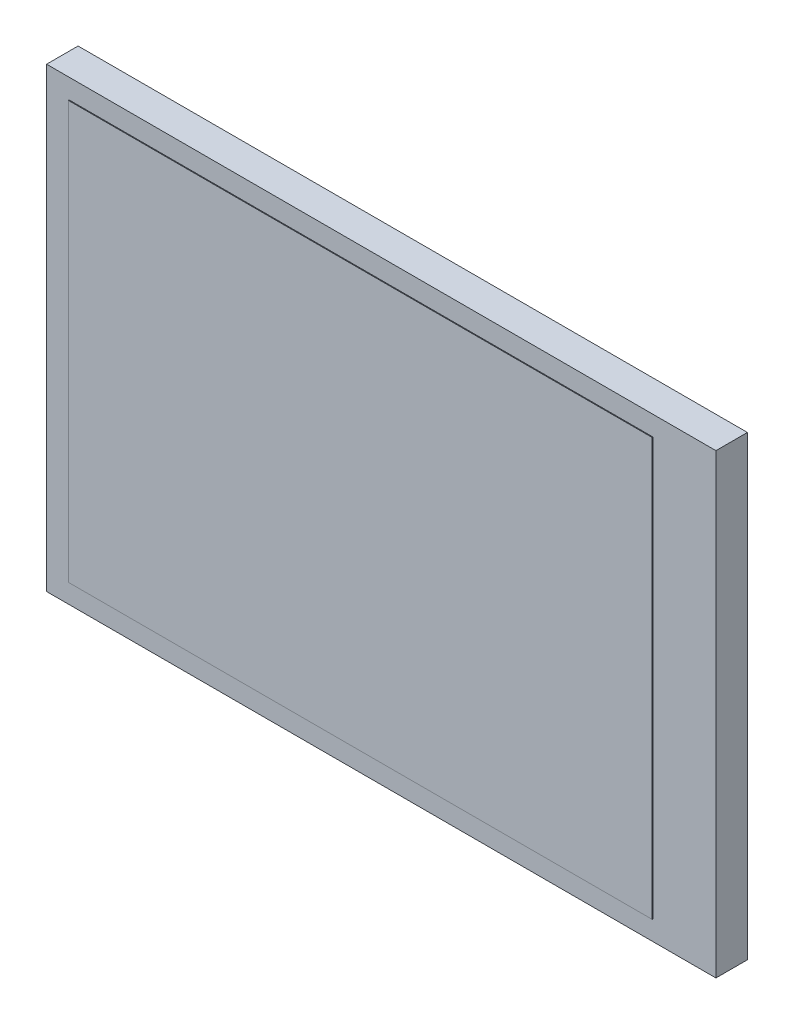
ISO-10303-21;
HEADER;
FILE_DESCRIPTION(('STEP AP214'),'2;1');
FILE_NAME('part.step','',(''),(''),'','','');
FILE_SCHEMA(('AUTOMOTIVE_DESIGN { 1 0 10303 214 1 1 1 1 }'));
ENDSEC;
DATA;
#1=APPLICATION_CONTEXT('core data for automotive mechanical design processes');
#2=APPLICATION_PROTOCOL_DEFINITION('international standard','automotive_design',2000,#1);
#3=PRODUCT_CONTEXT('',#1,'mechanical');
#4=PRODUCT('Part','Part','',(#3));
#5=PRODUCT_RELATED_PRODUCT_CATEGORY('part','',(#4));
#6=PRODUCT_DEFINITION_FORMATION('','',#4);
#7=PRODUCT_DEFINITION_CONTEXT('part definition',#1,'design');
#8=PRODUCT_DEFINITION('design','',#6,#7);
#9=PRODUCT_DEFINITION_SHAPE('','',#8);
#10=(LENGTH_UNIT() NAMED_UNIT(*) SI_UNIT(.MILLI.,.METRE.));
#11=(NAMED_UNIT(*) PLANE_ANGLE_UNIT() SI_UNIT($,.RADIAN.));
#12=(NAMED_UNIT(*) SI_UNIT($,.STERADIAN.) SOLID_ANGLE_UNIT());
#13=UNCERTAINTY_MEASURE_WITH_UNIT(LENGTH_MEASURE(1.E-05),#10,'distance_accuracy_value','');
#14=(GEOMETRIC_REPRESENTATION_CONTEXT(3) GLOBAL_UNCERTAINTY_ASSIGNED_CONTEXT((#13)) GLOBAL_UNIT_ASSIGNED_CONTEXT((#10,
#11,#12)) REPRESENTATION_CONTEXT('',''));
#15=CARTESIAN_POINT('',(0.,0.,0.));
#16=DIRECTION('',(0.,0.,1.));
#17=DIRECTION('',(1.,0.,0.));
#18=AXIS2_PLACEMENT_3D('',#15,#16,#17);
#19=CARTESIAN_POINT('',(0.,0.,4.));
#20=DIRECTION('',(-1.,0.,0.));
#21=DIRECTION('',(0.,0.,1.));
#22=AXIS2_PLACEMENT_3D('',#19,#20,#21);
#23=PLANE('',#22);
#24=DIRECTION('',(0.,1.,0.));
#25=VECTOR('',#24,1.);
#26=CARTESIAN_POINT('',(0.,0.,0.));
#27=LINE('',#26,#25);
#28=CARTESIAN_POINT('',(0.,0.,0.));
#29=VERTEX_POINT('',#28);
#30=CARTESIAN_POINT('',(0.,58.,0.));
#31=VERTEX_POINT('',#30);
#32=EDGE_CURVE('E129',#29,#31,#27,.T.);
#33=ORIENTED_EDGE('',*,*,#32,.T.);
#34=DIRECTION('',(0.,0.,-1.));
#35=VECTOR('',#34,1.);
#36=CARTESIAN_POINT('',(0.,58.,4.));
#37=LINE('',#36,#35);
#38=CARTESIAN_POINT('',(0.,58.,4.));
#39=VERTEX_POINT('',#38);
#40=EDGE_CURVE('E11',#39,#31,#37,.T.);
#41=ORIENTED_EDGE('',*,*,#40,.F.);
#42=DIRECTION('',(0.,1.,0.));
#43=VECTOR('',#42,1.);
#44=CARTESIAN_POINT('',(0.,0.,4.));
#45=LINE('',#44,#43);
#46=CARTESIAN_POINT('',(0.,0.,4.));
#47=VERTEX_POINT('',#46);
#48=EDGE_CURVE('E140',#47,#39,#45,.T.);
#49=ORIENTED_EDGE('',*,*,#48,.F.);
#50=DIRECTION('',(0.,0.,-1.));
#51=VECTOR('',#50,1.);
#52=CARTESIAN_POINT('',(0.,0.,4.));
#53=LINE('',#52,#51);
#54=EDGE_CURVE('E153',#47,#29,#53,.T.);
#55=ORIENTED_EDGE('',*,*,#54,.T.);
#56=EDGE_LOOP('',(#33,#41,#49,#55));
#57=FACE_BOUND('',#56,.T.);
#58=ADVANCED_FACE('F41',(#57),#23,.F.);
#59=CARTESIAN_POINT('',(0.,58.,4.));
#60=DIRECTION('',(0.,-1.,0.));
#61=DIRECTION('',(1.,0.,0.));
#62=AXIS2_PLACEMENT_3D('',#59,#60,#61);
#63=PLANE('',#62);
#64=DIRECTION('',(-1.,0.,0.));
#65=VECTOR('',#64,1.);
#66=CARTESIAN_POINT('',(0.,58.,0.));
#67=LINE('',#66,#65);
#68=CARTESIAN_POINT('',(-85.,58.,0.));
#69=VERTEX_POINT('',#68);
#70=EDGE_CURVE('E134',#31,#69,#67,.T.);
#71=ORIENTED_EDGE('',*,*,#70,.T.);
#72=DIRECTION('',(0.,0.,-1.));
#73=VECTOR('',#72,1.);
#74=CARTESIAN_POINT('',(-85.,58.,4.));
#75=LINE('',#74,#73);
#76=CARTESIAN_POINT('',(-85.,58.,4.));
#77=VERTEX_POINT('',#76);
#78=EDGE_CURVE('E49',#77,#69,#75,.T.);
#79=ORIENTED_EDGE('',*,*,#78,.F.);
#80=DIRECTION('',(-1.,0.,0.));
#81=VECTOR('',#80,1.);
#82=CARTESIAN_POINT('',(0.,58.,4.));
#83=LINE('',#82,#81);
#84=EDGE_CURVE('E144',#39,#77,#83,.T.);
#85=ORIENTED_EDGE('',*,*,#84,.F.);
#86=ORIENTED_EDGE('',*,*,#40,.T.);
#87=EDGE_LOOP('',(#71,#79,#85,#86));
#88=FACE_BOUND('',#87,.T.);
#89=ADVANCED_FACE('F190',(#88),#63,.F.);
#90=CARTESIAN_POINT('',(-85.,0.,4.));
#91=DIRECTION('',(1.,0.,0.));
#92=DIRECTION('',(0.,0.,-1.));
#93=AXIS2_PLACEMENT_3D('',#90,#91,#92);
#94=PLANE('',#93);
#95=DIRECTION('',(0.,-1.,0.));
#96=VECTOR('',#95,1.);
#97=CARTESIAN_POINT('',(-85.,0.,0.));
#98=LINE('',#97,#96);
#99=CARTESIAN_POINT('',(-85.,0.,0.));
#100=VERTEX_POINT('',#99);
#101=EDGE_CURVE('E157',#69,#100,#98,.T.);
#102=ORIENTED_EDGE('',*,*,#101,.T.);
#103=DIRECTION('',(0.,0.,-1.));
#104=VECTOR('',#103,1.);
#105=CARTESIAN_POINT('',(-85.,0.,4.));
#106=LINE('',#105,#104);
#107=CARTESIAN_POINT('',(-85.,0.,4.));
#108=VERTEX_POINT('',#107);
#109=EDGE_CURVE('E165',#108,#100,#106,.T.);
#110=ORIENTED_EDGE('',*,*,#109,.F.);
#111=DIRECTION('',(0.,-1.,0.));
#112=VECTOR('',#111,1.);
#113=CARTESIAN_POINT('',(-85.,0.,4.));
#114=LINE('',#113,#112);
#115=EDGE_CURVE('E148',#77,#108,#114,.T.);
#116=ORIENTED_EDGE('',*,*,#115,.F.);
#117=ORIENTED_EDGE('',*,*,#78,.T.);
#118=EDGE_LOOP('',(#102,#110,#116,#117));
#119=FACE_BOUND('',#118,.T.);
#120=ADVANCED_FACE('F174',(#119),#94,.F.);
#121=CARTESIAN_POINT('',(0.,0.,4.));
#122=DIRECTION('',(0.,1.,0.));
#123=DIRECTION('',(0.,0.,1.));
#124=AXIS2_PLACEMENT_3D('',#121,#122,#123);
#125=PLANE('',#124);
#126=DIRECTION('',(1.,0.,0.));
#127=VECTOR('',#126,1.);
#128=CARTESIAN_POINT('',(0.,0.,0.));
#129=LINE('',#128,#127);
#130=EDGE_CURVE('E145',#100,#29,#129,.T.);
#131=ORIENTED_EDGE('',*,*,#130,.T.);
#132=ORIENTED_EDGE('',*,*,#54,.F.);
#133=DIRECTION('',(1.,0.,0.));
#134=VECTOR('',#133,1.);
#135=CARTESIAN_POINT('',(0.,0.,4.));
#136=LINE('',#135,#134);
#137=EDGE_CURVE('E151',#108,#47,#136,.T.);
#138=ORIENTED_EDGE('',*,*,#137,.F.);
#139=ORIENTED_EDGE('',*,*,#109,.T.);
#140=EDGE_LOOP('',(#131,#132,#138,#139));
#141=FACE_BOUND('',#140,.T.);
#142=ADVANCED_FACE('F183',(#141),#125,.F.);
#143=CARTESIAN_POINT('',(0.,0.,4.));
#144=DIRECTION('',(0.,0.,1.));
#145=DIRECTION('',(1.,0.,0.));
#146=AXIS2_PLACEMENT_3D('',#143,#144,#145);
#147=PLANE('',#146);
#148=DIRECTION('',(-1.,0.,0.));
#149=VECTOR('',#148,1.);
#150=CARTESIAN_POINT('',(-7.99999999999999,55.5,4.));
#151=LINE('',#150,#149);
#152=CARTESIAN_POINT('',(-7.99999999999999,55.5,4.));
#153=VERTEX_POINT('',#152);
#154=CARTESIAN_POINT('',(-82.1441316608199,55.5,4.));
#155=VERTEX_POINT('',#154);
#156=EDGE_CURVE('E56',#153,#155,#151,.T.);
#157=ORIENTED_EDGE('',*,*,#156,.F.);
#158=DIRECTION('',(0.,1.,0.));
#159=VECTOR('',#158,1.);
#160=CARTESIAN_POINT('',(-7.99999999999999,2.5,4.));
#161=LINE('',#160,#159);
#162=CARTESIAN_POINT('',(-7.99999999999999,2.5,4.));
#163=VERTEX_POINT('',#162);
#164=EDGE_CURVE('E60',#163,#153,#161,.T.);
#165=ORIENTED_EDGE('',*,*,#164,.F.);
#166=DIRECTION('',(1.,0.,0.));
#167=VECTOR('',#166,1.);
#168=CARTESIAN_POINT('',(-82.1441316608199,2.5,4.));
#169=LINE('',#168,#167);
#170=CARTESIAN_POINT('',(-82.1441316608199,2.5,4.));
#171=VERTEX_POINT('',#170);
#172=EDGE_CURVE('E299',#171,#163,#169,.T.);
#173=ORIENTED_EDGE('',*,*,#172,.F.);
#174=DIRECTION('',(0.,-1.,0.));
#175=VECTOR('',#174,1.);
#176=CARTESIAN_POINT('',(-82.1441316608199,55.5,4.));
#177=LINE('',#176,#175);
#178=EDGE_CURVE('E309',#155,#171,#177,.T.);
#179=ORIENTED_EDGE('',*,*,#178,.F.);
#180=EDGE_LOOP('',(#157,#165,#173,#179));
#181=FACE_BOUND('',#180,.T.);
#182=ORIENTED_EDGE('',*,*,#48,.T.);
#183=ORIENTED_EDGE('',*,*,#84,.T.);
#184=ORIENTED_EDGE('',*,*,#115,.T.);
#185=ORIENTED_EDGE('',*,*,#137,.T.);
#186=EDGE_LOOP('',(#182,#183,#184,#185));
#187=FACE_BOUND('',#186,.T.);
#188=ADVANCED_FACE('F189',(#181,#187),#147,.T.);
#189=CARTESIAN_POINT('',(0.,0.,0.));
#190=DIRECTION('',(0.,0.,1.));
#191=DIRECTION('',(1.,0.,0.));
#192=AXIS2_PLACEMENT_3D('',#189,#190,#191);
#193=PLANE('',#192);
#194=ORIENTED_EDGE('',*,*,#32,.F.);
#195=ORIENTED_EDGE('',*,*,#130,.F.);
#196=ORIENTED_EDGE('',*,*,#101,.F.);
#197=ORIENTED_EDGE('',*,*,#70,.F.);
#198=EDGE_LOOP('',(#194,#195,#196,#197));
#199=FACE_BOUND('',#198,.T.);
#200=ADVANCED_FACE('F180',(#199),#193,.F.);
#201=CARTESIAN_POINT('',(-7.99999999999999,55.5,4.1));
#202=DIRECTION('',(0.,-1.,0.));
#203=DIRECTION('',(1.,0.,0.));
#204=AXIS2_PLACEMENT_3D('',#201,#202,#203);
#205=PLANE('',#204);
#206=ORIENTED_EDGE('',*,*,#156,.T.);
#207=DIRECTION('',(0.,0.,-1.));
#208=VECTOR('',#207,1.);
#209=CARTESIAN_POINT('',(-82.1441316608199,55.5,4.1));
#210=LINE('',#209,#208);
#211=CARTESIAN_POINT('',(-82.1441316608199,55.5,4.1));
#212=VERTEX_POINT('',#211);
#213=EDGE_CURVE('E109',#212,#155,#210,.T.);
#214=ORIENTED_EDGE('',*,*,#213,.F.);
#215=DIRECTION('',(-1.,0.,0.));
#216=VECTOR('',#215,1.);
#217=CARTESIAN_POINT('',(-7.99999999999999,55.5,4.1));
#218=LINE('',#217,#216);
#219=CARTESIAN_POINT('',(-7.99999999999999,55.5,4.1));
#220=VERTEX_POINT('',#219);
#221=EDGE_CURVE('E116',#220,#212,#218,.T.);
#222=ORIENTED_EDGE('',*,*,#221,.F.);
#223=DIRECTION('',(0.,0.,-1.));
#224=VECTOR('',#223,1.);
#225=CARTESIAN_POINT('',(-7.99999999999999,55.5,4.1));
#226=LINE('',#225,#224);
#227=EDGE_CURVE('E296',#220,#153,#226,.T.);
#228=ORIENTED_EDGE('',*,*,#227,.T.);
#229=EDGE_LOOP('',(#206,#214,#222,#228));
#230=FACE_BOUND('',#229,.T.);
#231=ADVANCED_FACE('F127',(#230),#205,.F.);
#232=CARTESIAN_POINT('',(-82.1441316608199,55.5,4.1));
#233=DIRECTION('',(1.,0.,0.));
#234=DIRECTION('',(0.,1.,0.));
#235=AXIS2_PLACEMENT_3D('',#232,#233,#234);
#236=PLANE('',#235);
#237=ORIENTED_EDGE('',*,*,#178,.T.);
#238=DIRECTION('',(0.,0.,-1.));
#239=VECTOR('',#238,1.);
#240=CARTESIAN_POINT('',(-82.1441316608199,2.5,4.1));
#241=LINE('',#240,#239);
#242=CARTESIAN_POINT('',(-82.1441316608199,2.5,4.1));
#243=VERTEX_POINT('',#242);
#244=EDGE_CURVE('E111',#243,#171,#241,.T.);
#245=ORIENTED_EDGE('',*,*,#244,.F.);
#246=DIRECTION('',(0.,-1.,0.));
#247=VECTOR('',#246,1.);
#248=CARTESIAN_POINT('',(-82.1441316608199,55.5,4.1));
#249=LINE('',#248,#247);
#250=EDGE_CURVE('E104',#212,#243,#249,.T.);
#251=ORIENTED_EDGE('',*,*,#250,.F.);
#252=ORIENTED_EDGE('',*,*,#213,.T.);
#253=EDGE_LOOP('',(#237,#245,#251,#252));
#254=FACE_BOUND('',#253,.T.);
#255=ADVANCED_FACE('F107',(#254),#236,.F.);
#256=CARTESIAN_POINT('',(-82.1441316608199,2.5,4.1));
#257=DIRECTION('',(0.,1.,0.));
#258=DIRECTION('',(0.,0.,1.));
#259=AXIS2_PLACEMENT_3D('',#256,#257,#258);
#260=PLANE('',#259);
#261=ORIENTED_EDGE('',*,*,#172,.T.);
#262=DIRECTION('',(0.,0.,-1.));
#263=VECTOR('',#262,1.);
#264=CARTESIAN_POINT('',(-7.99999999999999,2.5,4.1));
#265=LINE('',#264,#263);
#266=CARTESIAN_POINT('',(-7.99999999999999,2.5,4.1));
#267=VERTEX_POINT('',#266);
#268=EDGE_CURVE('E136',#267,#163,#265,.T.);
#269=ORIENTED_EDGE('',*,*,#268,.F.);
#270=DIRECTION('',(1.,0.,0.));
#271=VECTOR('',#270,1.);
#272=CARTESIAN_POINT('',(-82.1441316608199,2.5,4.1));
#273=LINE('',#272,#271);
#274=EDGE_CURVE('E115',#243,#267,#273,.T.);
#275=ORIENTED_EDGE('',*,*,#274,.F.);
#276=ORIENTED_EDGE('',*,*,#244,.T.);
#277=EDGE_LOOP('',(#261,#269,#275,#276));
#278=FACE_BOUND('',#277,.T.);
#279=ADVANCED_FACE('F208',(#278),#260,.F.);
#280=CARTESIAN_POINT('',(-7.99999999999999,2.5,4.1));
#281=DIRECTION('',(-1.,0.,0.));
#282=DIRECTION('',(0.,0.,1.));
#283=AXIS2_PLACEMENT_3D('',#280,#281,#282);
#284=PLANE('',#283);
#285=ORIENTED_EDGE('',*,*,#164,.T.);
#286=ORIENTED_EDGE('',*,*,#227,.F.);
#287=DIRECTION('',(0.,1.,0.));
#288=VECTOR('',#287,1.);
#289=CARTESIAN_POINT('',(-7.99999999999999,2.5,4.1));
#290=LINE('',#289,#288);
#291=EDGE_CURVE('E121',#267,#220,#290,.T.);
#292=ORIENTED_EDGE('',*,*,#291,.F.);
#293=ORIENTED_EDGE('',*,*,#268,.T.);
#294=EDGE_LOOP('',(#285,#286,#292,#293));
#295=FACE_BOUND('',#294,.T.);
#296=ADVANCED_FACE('F211',(#295),#284,.F.);
#297=CARTESIAN_POINT('',(0.,0.,4.1));
#298=DIRECTION('',(0.,0.,1.));
#299=DIRECTION('',(1.,0.,0.));
#300=AXIS2_PLACEMENT_3D('',#297,#298,#299);
#301=PLANE('',#300);
#302=ORIENTED_EDGE('',*,*,#221,.T.);
#303=ORIENTED_EDGE('',*,*,#250,.T.);
#304=ORIENTED_EDGE('',*,*,#274,.T.);
#305=ORIENTED_EDGE('',*,*,#291,.T.);
#306=EDGE_LOOP('',(#302,#303,#304,#305));
#307=FACE_BOUND('',#306,.T.);
#308=ADVANCED_FACE('F119',(#307),#301,.T.);
#309=CLOSED_SHELL('',(#58,#89,#120,#142,#188,#200,#231,#255,#279,#296,#308));
#310=MANIFOLD_SOLID_BREP('B2',#309);
#311=ADVANCED_BREP_SHAPE_REPRESENTATION('',(#18,#310),#14);
#312=SHAPE_DEFINITION_REPRESENTATION(#9,#311);
ENDSEC;
END-ISO-10303-21;
